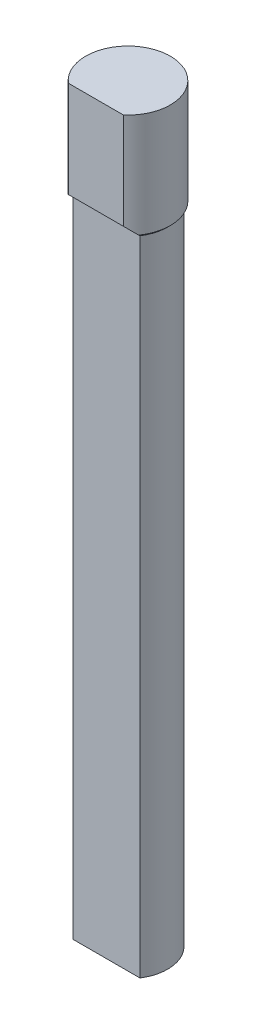
ISO-10303-21;
HEADER;
FILE_DESCRIPTION(('STEP AP214'),'2;1');
FILE_NAME('part.step','',(''),(''),'','','');
FILE_SCHEMA(('AUTOMOTIVE_DESIGN { 1 0 10303 214 1 1 1 1 }'));
ENDSEC;
DATA;
#1=APPLICATION_CONTEXT('core data for automotive mechanical design processes');
#2=APPLICATION_PROTOCOL_DEFINITION('international standard','automotive_design',2000,#1);
#3=PRODUCT_CONTEXT('',#1,'mechanical');
#4=PRODUCT('Part','Part','',(#3));
#5=PRODUCT_RELATED_PRODUCT_CATEGORY('part','',(#4));
#6=PRODUCT_DEFINITION_FORMATION('','',#4);
#7=PRODUCT_DEFINITION_CONTEXT('part definition',#1,'design');
#8=PRODUCT_DEFINITION('design','',#6,#7);
#9=PRODUCT_DEFINITION_SHAPE('','',#8);
#10=(LENGTH_UNIT() NAMED_UNIT(*) SI_UNIT(.MILLI.,.METRE.));
#11=(NAMED_UNIT(*) PLANE_ANGLE_UNIT() SI_UNIT($,.RADIAN.));
#12=(NAMED_UNIT(*) SI_UNIT($,.STERADIAN.) SOLID_ANGLE_UNIT());
#13=UNCERTAINTY_MEASURE_WITH_UNIT(LENGTH_MEASURE(1.E-05),#10,'distance_accuracy_value','');
#14=(GEOMETRIC_REPRESENTATION_CONTEXT(3) GLOBAL_UNCERTAINTY_ASSIGNED_CONTEXT((#13)) GLOBAL_UNIT_ASSIGNED_CONTEXT((#10,
#11,#12)) REPRESENTATION_CONTEXT('',''));
#15=CARTESIAN_POINT('',(0.,0.,0.));
#16=DIRECTION('',(0.,0.,1.));
#17=DIRECTION('',(1.,0.,0.));
#18=AXIS2_PLACEMENT_3D('',#15,#16,#17);
#19=CARTESIAN_POINT('',(0.,60.,0.));
#20=DIRECTION('',(0.,-1.,0.));
#21=DIRECTION('',(0.,0.,-1.));
#22=AXIS2_PLACEMENT_3D('',#19,#20,#21);
#23=CYLINDRICAL_SURFACE('',#22,3.7);
#24=CARTESIAN_POINT('',(0.,46.,0.));
#25=DIRECTION('',(0.,-1.,0.));
#26=DIRECTION('',(0.,0.,-1.));
#27=AXIS2_PLACEMENT_3D('',#24,#25,#26);
#28=CIRCLE('',#27,3.7);
#29=CARTESIAN_POINT('',(-0.749999999999998,46.,-3.62318920289846));
#30=VERTEX_POINT('',#29);
#31=CARTESIAN_POINT('',(0.750000000000003,46.,-3.62318920289846));
#32=VERTEX_POINT('',#31);
#33=EDGE_CURVE('E175',#30,#32,#28,.T.);
#34=ORIENTED_EDGE('',*,*,#33,.T.);
#35=DIRECTION('',(0.,-1.,0.));
#36=VECTOR('',#35,1.);
#37=CARTESIAN_POINT('',(0.750000000000002,60.,-3.62318920289846));
#38=LINE('',#37,#36);
#39=CARTESIAN_POINT('',(0.750000000000002,49.5,-3.62318920289846));
#40=VERTEX_POINT('',#39);
#41=EDGE_CURVE('E180',#32,#40,#38,.F.);
#42=ORIENTED_EDGE('',*,*,#41,.T.);
#43=CARTESIAN_POINT('',(0.,49.5,0.));
#44=DIRECTION('',(0.,1.,0.));
#45=DIRECTION('',(0.,0.,1.));
#46=AXIS2_PLACEMENT_3D('',#43,#44,#45);
#47=CIRCLE('',#46,3.7);
#48=CARTESIAN_POINT('',(-0.749999999999998,49.5,-3.62318920289846));
#49=VERTEX_POINT('',#48);
#50=EDGE_CURVE('E172',#40,#49,#47,.T.);
#51=ORIENTED_EDGE('',*,*,#50,.T.);
#52=DIRECTION('',(0.,-1.,0.));
#53=VECTOR('',#52,1.);
#54=CARTESIAN_POINT('',(-0.749999999999997,60.,-3.62318920289846));
#55=LINE('',#54,#53);
#56=EDGE_CURVE('E177',#49,#30,#55,.T.);
#57=ORIENTED_EDGE('',*,*,#56,.T.);
#58=EDGE_LOOP('',(#34,#42,#51,#57));
#59=FACE_BOUND('',#58,.T.);
#60=CARTESIAN_POINT('',(0.,0.,0.));
#61=DIRECTION('',(0.,1.,0.));
#62=DIRECTION('',(0.,0.,1.));
#63=AXIS2_PLACEMENT_3D('',#60,#61,#62);
#64=CIRCLE('',#63,3.7);
#65=CARTESIAN_POINT('',(3.11287648325468,0.,2.));
#66=VERTEX_POINT('',#65);
#67=CARTESIAN_POINT('',(-3.11287648325468,0.,2.));
#68=VERTEX_POINT('',#67);
#69=EDGE_CURVE('E149',#66,#68,#64,.T.);
#70=ORIENTED_EDGE('',*,*,#69,.T.);
#71=DIRECTION('',(0.,-1.,0.));
#72=VECTOR('',#71,1.);
#73=CARTESIAN_POINT('',(-3.11287648325468,60.,2.));
#74=LINE('',#73,#72);
#75=CARTESIAN_POINT('',(-3.11287648325468,60.,2.));
#76=VERTEX_POINT('',#75);
#77=EDGE_CURVE('E169',#76,#68,#74,.T.);
#78=ORIENTED_EDGE('',*,*,#77,.F.);
#79=CARTESIAN_POINT('',(0.,60.,0.));
#80=DIRECTION('',(0.,1.,0.));
#81=DIRECTION('',(0.,0.,1.));
#82=AXIS2_PLACEMENT_3D('',#79,#80,#81);
#83=CIRCLE('',#82,3.7);
#84=CARTESIAN_POINT('',(3.11287648325468,60.,2.));
#85=VERTEX_POINT('',#84);
#86=EDGE_CURVE('E158',#85,#76,#83,.T.);
#87=ORIENTED_EDGE('',*,*,#86,.F.);
#88=DIRECTION('',(0.,-1.,0.));
#89=VECTOR('',#88,1.);
#90=CARTESIAN_POINT('',(3.11287648325468,60.,2.));
#91=LINE('',#90,#89);
#92=EDGE_CURVE('E163',#85,#66,#91,.T.);
#93=ORIENTED_EDGE('',*,*,#92,.T.);
#94=EDGE_LOOP('',(#70,#78,#87,#93));
#95=FACE_BOUND('',#94,.T.);
#96=ADVANCED_FACE('F32',(#59,#95),#23,.T.);
#97=CARTESIAN_POINT('',(-3.11287648325468,60.,2.));
#98=DIRECTION('',(0.,0.,-1.));
#99=DIRECTION('',(-1.,0.,0.));
#100=AXIS2_PLACEMENT_3D('',#97,#98,#99);
#101=PLANE('',#100);
#102=DIRECTION('',(1.,0.,0.));
#103=VECTOR('',#102,1.);
#104=CARTESIAN_POINT('',(-3.11287648325468,0.,2.));
#105=LINE('',#104,#103);
#106=EDGE_CURVE('E161',#68,#66,#105,.T.);
#107=ORIENTED_EDGE('',*,*,#106,.T.);
#108=ORIENTED_EDGE('',*,*,#92,.F.);
#109=DIRECTION('',(1.,0.,0.));
#110=VECTOR('',#109,1.);
#111=CARTESIAN_POINT('',(-3.11287648325468,60.,2.));
#112=LINE('',#111,#110);
#113=EDGE_CURVE('E160',#76,#85,#112,.T.);
#114=ORIENTED_EDGE('',*,*,#113,.F.);
#115=ORIENTED_EDGE('',*,*,#77,.T.);
#116=EDGE_LOOP('',(#107,#108,#114,#115));
#117=FACE_BOUND('',#116,.T.);
#118=ADVANCED_FACE('F227',(#117),#101,.F.);
#119=CARTESIAN_POINT('',(0.,0.,0.));
#120=DIRECTION('',(0.,1.,0.));
#121=DIRECTION('',(0.,0.,1.));
#122=AXIS2_PLACEMENT_3D('',#119,#120,#121);
#123=PLANE('',#122);
#124=ORIENTED_EDGE('',*,*,#69,.F.);
#125=ORIENTED_EDGE('',*,*,#106,.F.);
#126=EDGE_LOOP('',(#124,#125));
#127=FACE_BOUND('',#126,.T.);
#128=ADVANCED_FACE('F231',(#127),#123,.F.);
#129=CARTESIAN_POINT('',(-0.749999999999998,49.5,-3.45));
#130=DIRECTION('',(-1.,0.,0.));
#131=DIRECTION('',(0.,-1.,0.));
#132=AXIS2_PLACEMENT_3D('',#129,#130,#131);
#133=PLANE('',#132);
#134=DIRECTION('',(0.,1.,0.));
#135=VECTOR('',#134,1.);
#136=CARTESIAN_POINT('',(-0.749999999999998,49.5,-4.4));
#137=LINE('',#136,#135);
#138=CARTESIAN_POINT('',(-0.749999999999998,46.6,-4.4));
#139=VERTEX_POINT('',#138);
#140=CARTESIAN_POINT('',(-0.749999999999998,48.9,-4.4));
#141=VERTEX_POINT('',#140);
#142=EDGE_CURVE('E137',#139,#141,#137,.T.);
#143=ORIENTED_EDGE('',*,*,#142,.F.);
#144=DIRECTION('',(0.,-0.707106781186548,0.707106781186548));
#145=VECTOR('',#144,1.);
#146=CARTESIAN_POINT('',(-0.749999999999998,47.575,-5.375));
#147=LINE('',#146,#145);
#148=CARTESIAN_POINT('',(-0.749999999999998,46.,-3.79999999999999));
#149=VERTEX_POINT('',#148);
#150=EDGE_CURVE('E196',#139,#149,#147,.T.);
#151=ORIENTED_EDGE('',*,*,#150,.T.);
#152=DIRECTION('',(0.,0.,-1.));
#153=VECTOR('',#152,1.);
#154=CARTESIAN_POINT('',(-0.749999999999998,46.,-3.45));
#155=LINE('',#154,#153);
#156=EDGE_CURVE('E146',#30,#149,#155,.T.);
#157=ORIENTED_EDGE('',*,*,#156,.F.);
#158=ORIENTED_EDGE('',*,*,#56,.F.);
#159=DIRECTION('',(0.,0.,-1.));
#160=VECTOR('',#159,1.);
#161=CARTESIAN_POINT('',(-0.749999999999998,49.5,-3.45));
#162=LINE('',#161,#160);
#163=CARTESIAN_POINT('',(-0.749999999999998,49.5,-3.8));
#164=VERTEX_POINT('',#163);
#165=EDGE_CURVE('E145',#49,#164,#162,.T.);
#166=ORIENTED_EDGE('',*,*,#165,.T.);
#167=DIRECTION('',(0.,-0.707106781186548,-0.707106781186548));
#168=VECTOR('',#167,1.);
#169=CARTESIAN_POINT('',(-0.749999999999998,49.675,-3.625));
#170=LINE('',#169,#168);
#171=EDGE_CURVE('E190',#164,#141,#170,.T.);
#172=ORIENTED_EDGE('',*,*,#171,.T.);
#173=EDGE_LOOP('',(#143,#151,#157,#158,#166,#172));
#174=FACE_BOUND('',#173,.T.);
#175=ADVANCED_FACE('F235',(#174),#133,.T.);
#176=CARTESIAN_POINT('',(-0.749999999999998,46.,-3.45));
#177=DIRECTION('',(0.,-1.,0.));
#178=DIRECTION('',(0.,0.,-1.));
#179=AXIS2_PLACEMENT_3D('',#176,#177,#178);
#180=PLANE('',#179);
#181=ORIENTED_EDGE('',*,*,#156,.T.);
#182=DIRECTION('',(1.,0.,0.));
#183=VECTOR('',#182,1.);
#184=CARTESIAN_POINT('',(0.750000000000003,46.,-3.79999999999999));
#185=LINE('',#184,#183);
#186=CARTESIAN_POINT('',(0.750000000000003,46.,-3.79999999999999));
#187=VERTEX_POINT('',#186);
#188=EDGE_CURVE('E198',#149,#187,#185,.T.);
#189=ORIENTED_EDGE('',*,*,#188,.T.);
#190=DIRECTION('',(0.,0.,-1.));
#191=VECTOR('',#190,1.);
#192=CARTESIAN_POINT('',(0.750000000000003,46.,-3.45));
#193=LINE('',#192,#191);
#194=EDGE_CURVE('E150',#32,#187,#193,.T.);
#195=ORIENTED_EDGE('',*,*,#194,.F.);
#196=ORIENTED_EDGE('',*,*,#33,.F.);
#197=EDGE_LOOP('',(#181,#189,#195,#196));
#198=FACE_BOUND('',#197,.T.);
#199=ADVANCED_FACE('F239',(#198),#180,.T.);
#200=CARTESIAN_POINT('',(0.750000000000002,49.5,-3.45));
#201=DIRECTION('',(1.,0.,0.));
#202=DIRECTION('',(0.,1.,0.));
#203=AXIS2_PLACEMENT_3D('',#200,#201,#202);
#204=PLANE('',#203);
#205=ORIENTED_EDGE('',*,*,#194,.T.);
#206=DIRECTION('',(0.,0.707106781186548,-0.707106781186548));
#207=VECTOR('',#206,1.);
#208=CARTESIAN_POINT('',(0.750000000000003,47.575,-5.375));
#209=LINE('',#208,#207);
#210=CARTESIAN_POINT('',(0.750000000000003,46.6,-4.4));
#211=VERTEX_POINT('',#210);
#212=EDGE_CURVE('E200',#187,#211,#209,.T.);
#213=ORIENTED_EDGE('',*,*,#212,.T.);
#214=DIRECTION('',(0.,-1.,0.));
#215=VECTOR('',#214,1.);
#216=CARTESIAN_POINT('',(0.750000000000002,49.5,-4.4));
#217=LINE('',#216,#215);
#218=CARTESIAN_POINT('',(0.750000000000002,48.9,-4.4));
#219=VERTEX_POINT('',#218);
#220=EDGE_CURVE('E139',#219,#211,#217,.T.);
#221=ORIENTED_EDGE('',*,*,#220,.F.);
#222=DIRECTION('',(0.,0.707106781186548,0.707106781186548));
#223=VECTOR('',#222,1.);
#224=CARTESIAN_POINT('',(0.750000000000002,49.675,-3.625));
#225=LINE('',#224,#223);
#226=CARTESIAN_POINT('',(0.750000000000002,49.5,-3.8));
#227=VERTEX_POINT('',#226);
#228=EDGE_CURVE('E186',#219,#227,#225,.T.);
#229=ORIENTED_EDGE('',*,*,#228,.T.);
#230=DIRECTION('',(0.,0.,-1.));
#231=VECTOR('',#230,1.);
#232=CARTESIAN_POINT('',(0.750000000000002,49.5,-3.45));
#233=LINE('',#232,#231);
#234=EDGE_CURVE('E153',#40,#227,#233,.T.);
#235=ORIENTED_EDGE('',*,*,#234,.F.);
#236=ORIENTED_EDGE('',*,*,#41,.F.);
#237=EDGE_LOOP('',(#205,#213,#221,#229,#235,#236));
#238=FACE_BOUND('',#237,.T.);
#239=ADVANCED_FACE('F244',(#238),#204,.T.);
#240=CARTESIAN_POINT('',(-0.749999999999998,49.5,-3.45));
#241=DIRECTION('',(0.,1.,0.));
#242=DIRECTION('',(0.,0.,1.));
#243=AXIS2_PLACEMENT_3D('',#240,#241,#242);
#244=PLANE('',#243);
#245=ORIENTED_EDGE('',*,*,#234,.T.);
#246=DIRECTION('',(-1.,0.,0.));
#247=VECTOR('',#246,1.);
#248=CARTESIAN_POINT('',(-0.749999999999998,49.5,-3.8));
#249=LINE('',#248,#247);
#250=EDGE_CURVE('E188',#227,#164,#249,.T.);
#251=ORIENTED_EDGE('',*,*,#250,.T.);
#252=ORIENTED_EDGE('',*,*,#165,.F.);
#253=ORIENTED_EDGE('',*,*,#50,.F.);
#254=EDGE_LOOP('',(#245,#251,#252,#253));
#255=FACE_BOUND('',#254,.T.);
#256=ADVANCED_FACE('F241',(#255),#244,.T.);
#257=CARTESIAN_POINT('',(0.,0.,-4.4));
#258=DIRECTION('',(0.,0.,1.));
#259=DIRECTION('',(1.,0.,0.));
#260=AXIS2_PLACEMENT_3D('',#257,#258,#259);
#261=PLANE('',#260);
#262=ORIENTED_EDGE('',*,*,#220,.T.);
#263=DIRECTION('',(-1.,0.,0.));
#264=VECTOR('',#263,1.);
#265=CARTESIAN_POINT('',(-0.749999999999998,46.6,-4.4));
#266=LINE('',#265,#264);
#267=EDGE_CURVE('E193',#211,#139,#266,.T.);
#268=ORIENTED_EDGE('',*,*,#267,.T.);
#269=ORIENTED_EDGE('',*,*,#142,.T.);
#270=DIRECTION('',(1.,0.,0.));
#271=VECTOR('',#270,1.);
#272=CARTESIAN_POINT('',(0.750000000000002,48.9,-4.4));
#273=LINE('',#272,#271);
#274=EDGE_CURVE('E183',#141,#219,#273,.T.);
#275=ORIENTED_EDGE('',*,*,#274,.T.);
#276=EDGE_LOOP('',(#262,#268,#269,#275));
#277=FACE_BOUND('',#276,.T.);
#278=ADVANCED_FACE('F223',(#277),#261,.F.);
#279=CARTESIAN_POINT('',(0.,48.9,-4.4));
#280=DIRECTION('',(0.,0.707106781186548,-0.707106781186548));
#281=DIRECTION('',(-1.,0.,0.));
#282=AXIS2_PLACEMENT_3D('',#279,#280,#281);
#283=PLANE('',#282);
#284=ORIENTED_EDGE('',*,*,#171,.F.);
#285=ORIENTED_EDGE('',*,*,#250,.F.);
#286=ORIENTED_EDGE('',*,*,#228,.F.);
#287=ORIENTED_EDGE('',*,*,#274,.F.);
#288=EDGE_LOOP('',(#284,#285,#286,#287));
#289=FACE_BOUND('',#288,.T.);
#290=ADVANCED_FACE('F219',(#289),#283,.T.);
#291=CARTESIAN_POINT('',(0.,46.6,-4.4));
#292=DIRECTION('',(0.,-0.707106781186547,-0.707106781186547));
#293=DIRECTION('',(1.,0.,0.));
#294=AXIS2_PLACEMENT_3D('',#291,#292,#293);
#295=PLANE('',#294);
#296=ORIENTED_EDGE('',*,*,#212,.F.);
#297=ORIENTED_EDGE('',*,*,#188,.F.);
#298=ORIENTED_EDGE('',*,*,#150,.F.);
#299=ORIENTED_EDGE('',*,*,#267,.F.);
#300=EDGE_LOOP('',(#296,#297,#298,#299));
#301=FACE_BOUND('',#300,.T.);
#302=ADVANCED_FACE('F215',(#301),#295,.T.);
#303=CARTESIAN_POINT('',(0.,70.,0.));
#304=DIRECTION('',(0.,-1.,0.));
#305=DIRECTION('',(0.,0.,-1.));
#306=AXIS2_PLACEMENT_3D('',#303,#304,#305);
#307=CYLINDRICAL_SURFACE('',#306,3.95);
#308=CARTESIAN_POINT('',(0.,58.,0.));
#309=DIRECTION('',(0.,0.70710678118655,-0.707106781186545));
#310=DIRECTION('',(0.,-0.707106781186545,-0.70710678118655));
#311=AXIS2_PLACEMENT_3D('',#308,#309,#310);
#312=ELLIPSE('',#311,5.58614357137371,3.95);
#313=CARTESIAN_POINT('',(2.56953303150592,61.,3.));
#314=VERTEX_POINT('',#313);
#315=CARTESIAN_POINT('',(3.24653661614958,60.25,2.25000000000001));
#316=VERTEX_POINT('',#315);
#317=EDGE_CURVE('E205',#314,#316,#312,.T.);
#318=ORIENTED_EDGE('',*,*,#317,.T.);
#319=CARTESIAN_POINT('',(0.,60.25,0.));
#320=DIRECTION('',(0.,1.,0.));
#321=DIRECTION('',(0.,0.,1.));
#322=AXIS2_PLACEMENT_3D('',#319,#320,#321);
#323=CIRCLE('',#322,3.95);
#324=CARTESIAN_POINT('',(-3.24653661614958,60.25,2.25000000000001));
#325=VERTEX_POINT('',#324);
#326=EDGE_CURVE('E207',#316,#325,#323,.T.);
#327=ORIENTED_EDGE('',*,*,#326,.T.);
#328=CARTESIAN_POINT('',(0.,58.,0.));
#329=DIRECTION('',(0.,0.70710678118655,-0.707106781186545));
#330=DIRECTION('',(0.,-0.707106781186545,-0.70710678118655));
#331=AXIS2_PLACEMENT_3D('',#328,#329,#330);
#332=ELLIPSE('',#331,5.58614357137371,3.95);
#333=CARTESIAN_POINT('',(-2.56953303150592,61.,3.));
#334=VERTEX_POINT('',#333);
#335=EDGE_CURVE('E136',#325,#334,#332,.T.);
#336=ORIENTED_EDGE('',*,*,#335,.T.);
#337=DIRECTION('',(0.,-1.,0.));
#338=VECTOR('',#337,1.);
#339=CARTESIAN_POINT('',(-2.56953303150592,70.,3.));
#340=LINE('',#339,#338);
#341=CARTESIAN_POINT('',(-2.56953303150592,70.,3.));
#342=VERTEX_POINT('',#341);
#343=EDGE_CURVE('E123',#342,#334,#340,.T.);
#344=ORIENTED_EDGE('',*,*,#343,.F.);
#345=CARTESIAN_POINT('',(0.,70.,0.));
#346=DIRECTION('',(0.,1.,0.));
#347=DIRECTION('',(0.,0.,1.));
#348=AXIS2_PLACEMENT_3D('',#345,#346,#347);
#349=CIRCLE('',#348,3.95);
#350=CARTESIAN_POINT('',(2.56953303150592,70.,3.));
#351=VERTEX_POINT('',#350);
#352=EDGE_CURVE('E129',#351,#342,#349,.T.);
#353=ORIENTED_EDGE('',*,*,#352,.F.);
#354=DIRECTION('',(0.,-1.,0.));
#355=VECTOR('',#354,1.);
#356=CARTESIAN_POINT('',(2.56953303150592,70.,3.));
#357=LINE('',#356,#355);
#358=EDGE_CURVE('E126',#351,#314,#357,.T.);
#359=ORIENTED_EDGE('',*,*,#358,.T.);
#360=EDGE_LOOP('',(#318,#327,#336,#344,#353,#359));
#361=FACE_BOUND('',#360,.T.);
#362=ADVANCED_FACE('F134',(#361),#307,.T.);
#363=CARTESIAN_POINT('',(-2.56953303150592,70.,3.));
#364=DIRECTION('',(0.,0.,-1.));
#365=DIRECTION('',(-1.,0.,0.));
#366=AXIS2_PLACEMENT_3D('',#363,#364,#365);
#367=PLANE('',#366);
#368=ORIENTED_EDGE('',*,*,#343,.T.);
#369=DIRECTION('',(1.,0.,0.));
#370=VECTOR('',#369,1.);
#371=CARTESIAN_POINT('',(-2.56953303150592,61.,3.));
#372=LINE('',#371,#370);
#373=EDGE_CURVE('E202',#334,#314,#372,.T.);
#374=ORIENTED_EDGE('',*,*,#373,.T.);
#375=ORIENTED_EDGE('',*,*,#358,.F.);
#376=DIRECTION('',(1.,0.,0.));
#377=VECTOR('',#376,1.);
#378=CARTESIAN_POINT('',(-2.56953303150592,70.,3.));
#379=LINE('',#378,#377);
#380=EDGE_CURVE('E118',#342,#351,#379,.T.);
#381=ORIENTED_EDGE('',*,*,#380,.F.);
#382=EDGE_LOOP('',(#368,#374,#375,#381));
#383=FACE_BOUND('',#382,.T.);
#384=ADVANCED_FACE('F120',(#383),#367,.F.);
#385=CARTESIAN_POINT('',(0.,70.,0.));
#386=DIRECTION('',(0.,1.,0.));
#387=DIRECTION('',(0.,0.,1.));
#388=AXIS2_PLACEMENT_3D('',#385,#386,#387);
#389=PLANE('',#388);
#390=ORIENTED_EDGE('',*,*,#352,.T.);
#391=ORIENTED_EDGE('',*,*,#380,.T.);
#392=EDGE_LOOP('',(#390,#391));
#393=FACE_BOUND('',#392,.T.);
#394=ADVANCED_FACE('F131',(#393),#389,.T.);
#395=CARTESIAN_POINT('',(-2.56953303150592,61.,3.));
#396=DIRECTION('',(0.,0.70710678118655,-0.707106781186545));
#397=DIRECTION('',(1.,0.,0.));
#398=AXIS2_PLACEMENT_3D('',#395,#396,#397);
#399=PLANE('',#398);
#400=ORIENTED_EDGE('',*,*,#335,.F.);
#401=CARTESIAN_POINT('',(-3.24653661614958,60.25,2.25000000000001));
#402=CARTESIAN_POINT('',(-3.22466955756692,60.208223849676,2.20822384967604));
#403=CARTESIAN_POINT('',(-3.20259768834691,60.1665024493859,2.16650244938585));
#404=CARTESIAN_POINT('',(-3.15804431103879,60.083169115966,2.08316911596603));
#405=CARTESIAN_POINT('',(-3.13556280262716,60.0415571829229,2.04155718292288));
#406=CARTESIAN_POINT('',(-3.11287648325469,60.,1.99999999999999));
#407=B_SPLINE_CURVE_WITH_KNOTS('',3,(#401,#402,#403,#404,#405,#406),.UNSPECIFIED.,.F.,.F.,(4,2,
4),(0.,0.188988520966003,0.37797719118922),.UNSPECIFIED.);
#408=EDGE_CURVE('E11',#325,#76,#407,.T.);
#409=ORIENTED_EDGE('',*,*,#408,.T.);
#410=ORIENTED_EDGE('',*,*,#113,.T.);
#411=CARTESIAN_POINT('',(3.11287648325467,60.,1.99999999999999));
#412=CARTESIAN_POINT('',(3.13556280262715,60.0415571829229,2.04155718292288));
#413=CARTESIAN_POINT('',(3.15804431103878,60.083169115966,2.08316911596603));
#414=CARTESIAN_POINT('',(3.20259768834692,60.1665024493859,2.16650244938585));
#415=CARTESIAN_POINT('',(3.22466955756693,60.208223849676,2.20822384967603));
#416=CARTESIAN_POINT('',(3.2465366161496,60.25,2.25));
#417=B_SPLINE_CURVE_WITH_KNOTS('',3,(#411,#412,#413,#414,#415,#416),.UNSPECIFIED.,.F.,.F.,(4,2,
4),(0.,0.188988670223217,0.377977191189218),.UNSPECIFIED.);
#418=EDGE_CURVE('E44',#85,#316,#417,.T.);
#419=ORIENTED_EDGE('',*,*,#418,.T.);
#420=ORIENTED_EDGE('',*,*,#317,.F.);
#421=ORIENTED_EDGE('',*,*,#373,.F.);
#422=EDGE_LOOP('',(#400,#409,#410,#419,#420,#421));
#423=FACE_BOUND('',#422,.T.);
#424=ADVANCED_FACE('F211',(#423),#399,.F.);
#425=CARTESIAN_POINT('',(0.,60.25,0.));
#426=DIRECTION('',(0.,1.,0.));
#427=DIRECTION('',(0.,0.,1.));
#428=AXIS2_PLACEMENT_3D('',#425,#426,#427);
#429=CONICAL_SURFACE('',#428,3.95,0.785398163397445);
#430=ORIENTED_EDGE('',*,*,#418,.F.);
#431=ORIENTED_EDGE('',*,*,#86,.T.);
#432=ORIENTED_EDGE('',*,*,#408,.F.);
#433=ORIENTED_EDGE('',*,*,#326,.F.);
#434=EDGE_LOOP('',(#430,#431,#432,#433));
#435=FACE_BOUND('',#434,.T.);
#436=ADVANCED_FACE('F34',(#435),#429,.T.);
#437=CLOSED_SHELL('',(#96,#118,#128,#175,#199,#239,#256,#278,#290,#302,#362,#384,#394,#424,#436));
#438=MANIFOLD_SOLID_BREP('B2',#437);
#439=ADVANCED_BREP_SHAPE_REPRESENTATION('',(#18,#438),#14);
#440=SHAPE_DEFINITION_REPRESENTATION(#9,#439);
ENDSEC;
END-ISO-10303-21;
